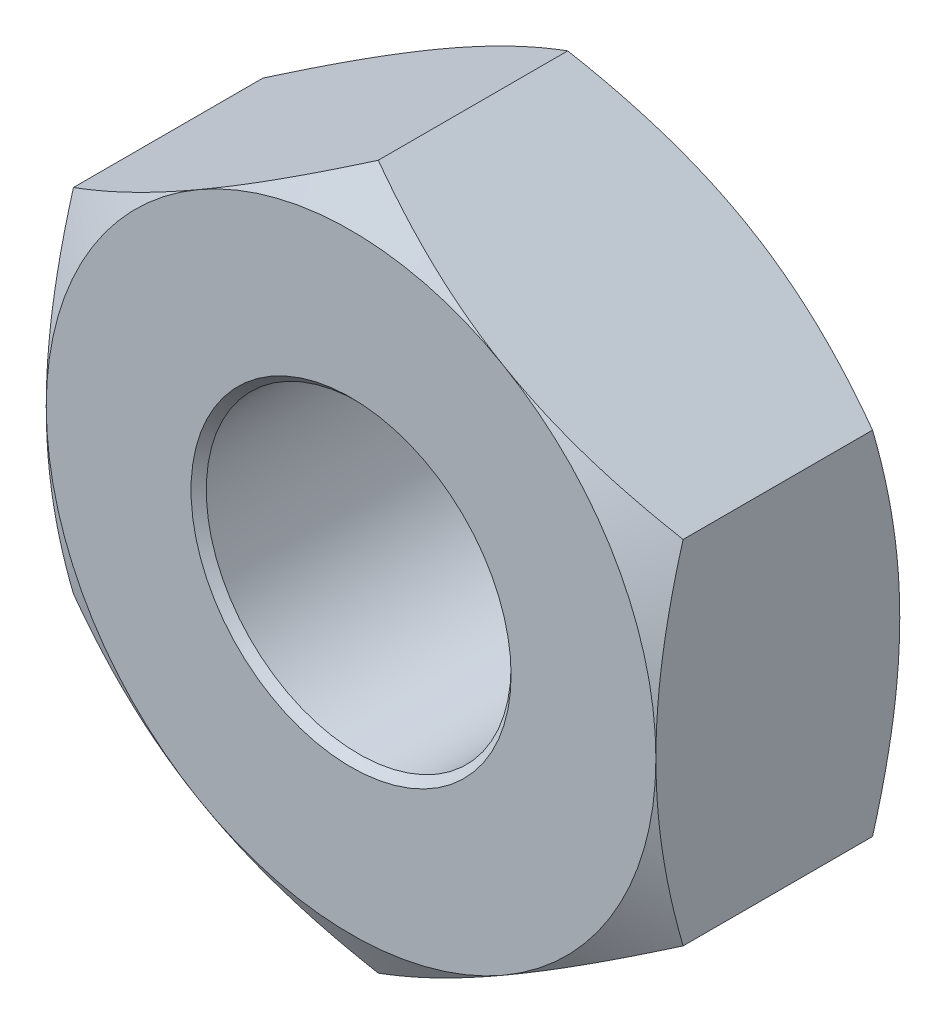
ISO-10303-21;
HEADER;
FILE_DESCRIPTION(('STEP AP214'),'2;1');
FILE_NAME('part.step','',(''),(''),'','','');
FILE_SCHEMA(('AUTOMOTIVE_DESIGN { 1 0 10303 214 1 1 1 1 }'));
ENDSEC;
DATA;
#1=APPLICATION_CONTEXT('core data for automotive mechanical design processes');
#2=APPLICATION_PROTOCOL_DEFINITION('international standard','automotive_design',2000,#1);
#3=PRODUCT_CONTEXT('',#1,'mechanical');
#4=PRODUCT('Part','Part','',(#3));
#5=PRODUCT_RELATED_PRODUCT_CATEGORY('part','',(#4));
#6=PRODUCT_DEFINITION_FORMATION('','',#4);
#7=PRODUCT_DEFINITION_CONTEXT('part definition',#1,'design');
#8=PRODUCT_DEFINITION('design','',#6,#7);
#9=PRODUCT_DEFINITION_SHAPE('','',#8);
#10=(LENGTH_UNIT() NAMED_UNIT(*) SI_UNIT(.MILLI.,.METRE.));
#11=(NAMED_UNIT(*) PLANE_ANGLE_UNIT() SI_UNIT($,.RADIAN.));
#12=(NAMED_UNIT(*) SI_UNIT($,.STERADIAN.) SOLID_ANGLE_UNIT());
#13=UNCERTAINTY_MEASURE_WITH_UNIT(LENGTH_MEASURE(1.E-05),#10,'distance_accuracy_value','');
#14=(GEOMETRIC_REPRESENTATION_CONTEXT(3) GLOBAL_UNCERTAINTY_ASSIGNED_CONTEXT((#13)) GLOBAL_UNIT_ASSIGNED_CONTEXT((#10,
#11,#12)) REPRESENTATION_CONTEXT('',''));
#15=CARTESIAN_POINT('',(0.,0.,0.));
#16=DIRECTION('',(0.,0.,1.));
#17=DIRECTION('',(1.,0.,0.));
#18=AXIS2_PLACEMENT_3D('',#15,#16,#17);
#19=CARTESIAN_POINT('',(0.,0.,1.6));
#20=DIRECTION('',(0.,0.,1.));
#21=DIRECTION('',(1.,0.,0.));
#22=AXIS2_PLACEMENT_3D('',#19,#20,#21);
#23=PLANE('',#22);
#24=CARTESIAN_POINT('',(0.,0.,1.6));
#25=DIRECTION('',(0.,0.,1.));
#26=DIRECTION('',(1.,0.,0.));
#27=AXIS2_PLACEMENT_3D('',#24,#25,#26);
#28=CIRCLE('',#27,1.04999948326116);
#29=CARTESIAN_POINT('',(1.04999948326116,0.,1.6));
#30=VERTEX_POINT('',#29);
#31=EDGE_CURVE('E55',#30,#30,#28,.F.);
#32=ORIENTED_EDGE('',*,*,#31,.T.);
#33=EDGE_LOOP('',(#32));
#34=FACE_BOUND('',#33,.T.);
#35=CARTESIAN_POINT('',(0.,0.,1.59999999999627));
#36=DIRECTION('',(0.,0.,-1.));
#37=DIRECTION('',(-1.,0.,0.));
#38=AXIS2_PLACEMENT_3D('',#35,#36,#37);
#39=CIRCLE('',#38,2.00000000000955);
#40=CARTESIAN_POINT('',(-2.00000000000477,-1.06547499753617E-11,1.59999999999903));
#41=VERTEX_POINT('',#40);
#42=CARTESIAN_POINT('',(-0.999999999983348,-1.73205080758389,1.59999999999908));
#43=VERTEX_POINT('',#42);
#44=EDGE_CURVE('E505',#41,#43,#39,.F.);
#45=ORIENTED_EDGE('',*,*,#44,.T.);
#46=CARTESIAN_POINT('',(0.,0.,1.59999999999627));
#47=DIRECTION('',(0.,0.,-1.));
#48=DIRECTION('',(-1.,0.,0.));
#49=AXIS2_PLACEMENT_3D('',#46,#47,#48);
#50=CIRCLE('',#49,2.00000000000955);
#51=CARTESIAN_POINT('',(1.00000000001005,-1.73205080756882,1.59999999999627));
#52=VERTEX_POINT('',#51);
#53=EDGE_CURVE('E509',#43,#52,#50,.F.);
#54=ORIENTED_EDGE('',*,*,#53,.T.);
#55=CARTESIAN_POINT('',(0.,0.,1.59999999999627));
#56=DIRECTION('',(0.,0.,-1.));
#57=DIRECTION('',(-1.,0.,0.));
#58=AXIS2_PLACEMENT_3D('',#55,#56,#57);
#59=CIRCLE('',#58,2.00000000000955);
#60=CARTESIAN_POINT('',(2.00000000000477,1.31078124881616E-11,1.59999999999903));
#61=VERTEX_POINT('',#60);
#62=EDGE_CURVE('E489',#52,#61,#59,.F.);
#63=ORIENTED_EDGE('',*,*,#62,.T.);
#64=CARTESIAN_POINT('',(0.,0.,1.59999999999627));
#65=DIRECTION('',(0.,0.,-1.));
#66=DIRECTION('',(-1.,0.,0.));
#67=AXIS2_PLACEMENT_3D('',#64,#65,#66);
#68=CIRCLE('',#67,2.00000000000955);
#69=CARTESIAN_POINT('',(0.999999999983347,1.73205080758389,1.59999999999908));
#70=VERTEX_POINT('',#69);
#71=EDGE_CURVE('E493',#61,#70,#68,.F.);
#72=ORIENTED_EDGE('',*,*,#71,.T.);
#73=CARTESIAN_POINT('',(0.,0.,1.59999999999627));
#74=DIRECTION('',(0.,0.,-1.));
#75=DIRECTION('',(-1.,0.,0.));
#76=AXIS2_PLACEMENT_3D('',#73,#74,#75);
#77=CIRCLE('',#76,2.00000000000955);
#78=CARTESIAN_POINT('',(-1.00000000001758,1.73205080756447,1.59999999999891));
#79=VERTEX_POINT('',#78);
#80=EDGE_CURVE('E497',#70,#79,#77,.F.);
#81=ORIENTED_EDGE('',*,*,#80,.T.);
#82=CARTESIAN_POINT('',(0.,0.,1.59999999999627));
#83=DIRECTION('',(0.,0.,-1.));
#84=DIRECTION('',(-1.,0.,0.));
#85=AXIS2_PLACEMENT_3D('',#82,#83,#84);
#86=CIRCLE('',#85,2.00000000000955);
#87=EDGE_CURVE('E501',#79,#41,#86,.F.);
#88=ORIENTED_EDGE('',*,*,#87,.T.);
#89=EDGE_LOOP('',(#45,#54,#63,#72,#81,#88));
#90=FACE_BOUND('',#89,.T.);
#91=ADVANCED_FACE('F44',(#34,#90),#23,.T.);
#92=CARTESIAN_POINT('',(0.,0.,0.179704591744212));
#93=DIRECTION('',(0.,0.,1.));
#94=DIRECTION('',(1.,0.,0.));
#95=AXIS2_PLACEMENT_3D('',#92,#93,#94);
#96=CONICAL_SURFACE('',#95,2.31125748325667,1.04719755118647);
#97=CARTESIAN_POINT('',(1.00000000009983,-1.73205080751171,-5.27795129464394E-12));
#98=CARTESIAN_POINT('',(0.957553135780858,-1.75655751605253,-6.25001354358371E-06));
#99=CARTESIAN_POINT('',(0.915112033127915,-1.78106089809391,0.00104087786203287));
#100=CARTESIAN_POINT('',(0.830313163211141,-1.83001954846734,0.00518690912419284));
#101=CARTESIAN_POINT('',(0.787955381114201,-1.85447482536328,0.00828540632418732));
#102=CARTESIAN_POINT('',(0.661526349253162,-1.92746866094164,0.0205338276065958));
#103=CARTESIAN_POINT('',(0.577659688525369,-1.97588910008887,0.0326378545118785));
#104=CARTESIAN_POINT('',(0.411032187688577,-2.07209153255139,0.0637636982833002));
#105=CARTESIAN_POINT('',(0.328270220585604,-2.11987417653696,0.0827777998463105));
#106=CARTESIAN_POINT('',(0.163458169984431,-2.21502845831724,0.126628872500844));
#107=CARTESIAN_POINT('',(0.0814138361323034,-2.26239677655225,0.151494923979016));
#108=CARTESIAN_POINT('',(8.39387136399563E-08,-2.30940102829696,0.178632766973462));
#109=B_SPLINE_CURVE_WITH_KNOTS('',3,(#97,#98,#99,#100,#101,#102,#103,#104,#105,#106,#107,#108),
.UNSPECIFIED.,.F.,.F.,(4,2,2,2,2,4),(0.,0.147016662691409,0.294004223678316,0.586460846601992,
0.878591931243796,1.17220656932657),.UNSPECIFIED.);
#110=CARTESIAN_POINT('',(1.00000000005232,-1.73205080754442,0.));
#111=VERTEX_POINT('',#110);
#112=CARTESIAN_POINT('',(2.88638918786199E-08,-2.30940109342323,0.178632804574129));
#113=VERTEX_POINT('',#112);
#114=EDGE_CURVE('E132',#111,#113,#109,.T.);
#115=ORIENTED_EDGE('',*,*,#114,.T.);
#116=CARTESIAN_POINT('',(5.7727783417525E-08,-2.30940111008745,0.178632814195226));
#117=CARTESIAN_POINT('',(-0.0814137056232576,-2.26239685190099,0.15149496461561));
#118=CARTESIAN_POINT('',(-0.16345805080081,-2.21502852712724,0.126628906855918));
#119=CARTESIAN_POINT('',(-0.32827012427305,-2.11987423214234,0.0827778228415323));
#120=CARTESIAN_POINT('',(-0.411032102918675,-2.07209158149262,0.0637637161885128));
#121=CARTESIAN_POINT('',(-0.57765962727959,-1.97588913544844,0.0326378638856466));
#122=CARTESIAN_POINT('',(-0.661526299989791,-1.92746868938316,0.0205338335442737));
#123=CARTESIAN_POINT('',(-0.787955350075264,-1.85447484328292,0.00828540874369762));
#124=CARTESIAN_POINT('',(-0.830313138326771,-1.83001956283364,0.00518691064340968));
#125=CARTESIAN_POINT('',(-0.915112020591133,-1.78106090533133,0.00104087817053289));
#126=CARTESIAN_POINT('',(-0.957553129437112,-1.75655751971439,-6.25001511778424E-06));
#127=CARTESIAN_POINT('',(-0.9999999999518,-1.73205080759648,-5.62636136566686E-12));
#128=B_SPLINE_CURVE_WITH_KNOTS('',3,(#116,#117,#118,#119,#120,#121,#122,#123,#124,#125,#126,
#127),.UNSPECIFIED.,.F.,.F.,(4,2,2,2,2,4),(0.,0.293614680744132,0.585745807531427,
0.878202472794855,1.02519005521309,1.17220673935671),.UNSPECIFIED.);
#129=CARTESIAN_POINT('',(-0.999999999954236,-1.7320508076007,-2.81314002525196E-12));
#130=VERTEX_POINT('',#129);
#131=EDGE_CURVE('E142',#113,#130,#128,.T.);
#132=ORIENTED_EDGE('',*,*,#131,.T.);
#133=CARTESIAN_POINT('',(0.,0.,0.));
#134=DIRECTION('',(0.,0.,1.));
#135=DIRECTION('',(1.,0.,0.));
#136=AXIS2_PLACEMENT_3D('',#133,#134,#135);
#137=CIRCLE('',#136,2.00000000000955);
#138=EDGE_CURVE('E146',#130,#111,#137,.T.);
#139=ORIENTED_EDGE('',*,*,#138,.T.);
#140=EDGE_LOOP('',(#115,#132,#139));
#141=FACE_BOUND('',#140,.T.);
#142=ADVANCED_FACE('F148',(#141),#96,.T.);
#143=CARTESIAN_POINT('',(0.,0.,0.179704591744212));
#144=DIRECTION('',(0.,0.,1.));
#145=DIRECTION('',(1.,0.,0.));
#146=AXIS2_PLACEMENT_3D('',#143,#144,#145);
#147=CONICAL_SURFACE('',#146,2.31125748325667,1.04719755118647);
#148=CARTESIAN_POINT('',(0.9999999999518,1.73205080759648,-5.6263452677451E-12));
#149=CARTESIAN_POINT('',(1.04244686426861,1.70754409905691,-6.25001304988145E-06));
#150=CARTESIAN_POINT('',(1.08488796691937,1.68304071701679,0.00104087786325986));
#151=CARTESIAN_POINT('',(1.16968683683177,1.63408206664589,0.00518690912666146));
#152=CARTESIAN_POINT('',(1.21204461892652,1.60962678975121,0.00828540632716436));
#153=CARTESIAN_POINT('',(1.33847365078104,1.53663295417662,0.0205338276107514));
#154=CARTESIAN_POINT('',(1.4223403115045,1.48821251503189,0.0326378545163663));
#155=CARTESIAN_POINT('',(1.58896781233272,1.39201008257432,0.0637636982876378));
#156=CARTESIAN_POINT('',(1.67172977943145,1.3442274385912,0.0827777998501674));
#157=CARTESIAN_POINT('',(1.83654183002418,1.24907315681579,0.126628872503088));
#158=CARTESIAN_POINT('',(1.91858616387211,1.2017048385832,0.15149492398012));
#159=CARTESIAN_POINT('',(1.99999991606156,1.15470058684088,0.178632766973196));
#160=B_SPLINE_CURVE_WITH_KNOTS('',3,(#148,#149,#150,#151,#152,#153,#154,#155,#156,#157,#158,
#159),.UNSPECIFIED.,.F.,.F.,(4,2,2,2,2,4),(0.,0.147016662683917,0.294004223663335,
0.586460846572301,0.878591931199455,1.17220656926731),.UNSPECIFIED.);
#161=CARTESIAN_POINT('',(0.999999999978304,1.7320508075868,0.));
#162=VERTEX_POINT('',#161);
#163=CARTESIAN_POINT('',(2.,1.15470057170804,0.178632804573939));
#164=VERTEX_POINT('',#163);
#165=EDGE_CURVE('E378',#162,#164,#160,.T.);
#166=ORIENTED_EDGE('',*,*,#165,.T.);
#167=CARTESIAN_POINT('',(2.,1.15470060503708,0.178632814195205));
#168=CARTESIAN_POINT('',(2.,1.06069208866294,0.151494964615247));
#169=CARTESIAN_POINT('',(2.,0.965955439114202,0.126628906855271));
#170=CARTESIAN_POINT('',(2.,0.775646849141912,0.0827778228404902));
#171=CARTESIAN_POINT('',(2.,0.680081547841225,0.0637637161873568));
#172=CARTESIAN_POINT('',(2.,0.487676655750345,0.0326378638844715));
#173=CARTESIAN_POINT('',(2.,0.390835763618521,0.0205338335431938));
#174=CARTESIAN_POINT('',(2.,0.244848071416126,0.00828540874293441));
#175=CARTESIAN_POINT('',(2.,0.195937510516907,0.00518691064278159));
#176=CARTESIAN_POINT('',(2.,0.0980201955109998,0.00104087817023259));
#177=CARTESIAN_POINT('',(2.,0.0490134242764938,-6.25001522539535E-06));
#178=CARTESIAN_POINT('',(2.,4.00311871255267E-11,-5.51340468006996E-12));
#179=B_SPLINE_CURVE_WITH_KNOTS('',3,(#167,#168,#169,#170,#171,#172,#173,#174,#175,#176,#177,
#178),.UNSPECIFIED.,.F.,.F.,(4,2,2,2,2,4),(0.,0.293614680747936,0.585745807538968,
0.878202472806148,1.0251900552263,1.17220673937183),.UNSPECIFIED.);
#180=CARTESIAN_POINT('',(2.00000000000477,2.66878533161652E-11,0.));
#181=VERTEX_POINT('',#180);
#182=EDGE_CURVE('E351',#164,#181,#179,.T.);
#183=ORIENTED_EDGE('',*,*,#182,.T.);
#184=CARTESIAN_POINT('',(0.,0.,0.));
#185=DIRECTION('',(0.,0.,1.));
#186=DIRECTION('',(1.,0.,0.));
#187=AXIS2_PLACEMENT_3D('',#184,#185,#186);
#188=CIRCLE('',#187,2.00000000000955);
#189=EDGE_CURVE('E154',#181,#162,#188,.T.);
#190=ORIENTED_EDGE('',*,*,#189,.T.);
#191=EDGE_LOOP('',(#166,#183,#190));
#192=FACE_BOUND('',#191,.T.);
#193=ADVANCED_FACE('F369',(#192),#147,.T.);
#194=CARTESIAN_POINT('',(0.,0.,0.179704591744212));
#195=DIRECTION('',(0.,0.,1.));
#196=DIRECTION('',(1.,0.,0.));
#197=AXIS2_PLACEMENT_3D('',#194,#195,#196);
#198=CONICAL_SURFACE('',#197,2.31125748325667,1.04719755118647);
#199=CARTESIAN_POINT('',(-1.00000000009983,1.73205080751171,-5.27806108294615E-12));
#200=CARTESIAN_POINT('',(-0.957553135780819,1.75655751605255,-6.25001354380122E-06));
#201=CARTESIAN_POINT('',(-0.915112033127838,1.78106089809395,0.00104087786203455));
#202=CARTESIAN_POINT('',(-0.830313163210987,1.83001954846743,0.00518690912420207));
#203=CARTESIAN_POINT('',(-0.787955381114008,1.85447482536339,0.0082854063242022));
#204=CARTESIAN_POINT('',(-0.661526349252856,1.92746866094182,0.0205338276066326));
#205=CARTESIAN_POINT('',(-0.577659688524988,1.97588910008909,0.0326378545119368));
#206=CARTESIAN_POINT('',(-0.411032187688049,2.07209153255169,0.0637636982834116));
#207=CARTESIAN_POINT('',(-0.328270220585004,2.1198741765373,0.0827777998464536));
#208=CARTESIAN_POINT('',(-0.163458169983688,2.21502845831767,0.126628872501058));
#209=CARTESIAN_POINT('',(-0.0814138361314898,2.26239677655272,0.151494923979269));
#210=CARTESIAN_POINT('',(-8.39378305998906E-08,2.30940102829747,0.178632766973757));
#211=B_SPLINE_CURVE_WITH_KNOTS('',3,(#199,#200,#201,#202,#203,#204,#205,#206,#207,#208,#209,
#210),.UNSPECIFIED.,.F.,.F.,(4,2,2,2,2,4),(0.,0.147016662691544,0.294004223678584,
0.586460846602524,0.878591931244592,1.17220656932763),.UNSPECIFIED.);
#212=CARTESIAN_POINT('',(-1.00000000005232,1.73205080754442,0.));
#213=VERTEX_POINT('',#212);
#214=CARTESIAN_POINT('',(-2.88634248931267E-08,2.30940109342296,0.178632804573974));
#215=VERTEX_POINT('',#214);
#216=EDGE_CURVE('E340',#213,#215,#211,.T.);
#217=ORIENTED_EDGE('',*,*,#216,.T.);
#218=CARTESIAN_POINT('',(-5.77268495065159E-08,2.30940111008692,0.178632814194914));
#219=CARTESIAN_POINT('',(0.0814137056241179,2.26239685190049,0.151494964615342));
#220=CARTESIAN_POINT('',(0.163458050801595,2.21502852712679,0.126628906855692));
#221=CARTESIAN_POINT('',(0.328270124273685,2.11987423214197,0.082777822841381));
#222=CARTESIAN_POINT('',(0.411032102919234,2.0720915814923,0.0637637161883951));
#223=CARTESIAN_POINT('',(0.577659627279993,1.97588913544821,0.032637863885585));
#224=CARTESIAN_POINT('',(0.661526299990115,1.92746868938298,0.0205338335442345));
#225=CARTESIAN_POINT('',(0.787955350075468,1.85447484328281,0.00828540874368162));
#226=CARTESIAN_POINT('',(0.830313138326935,1.83001956283354,0.00518691064339969));
#227=CARTESIAN_POINT('',(0.915112020591215,1.78106090533128,0.00104087817053097));
#228=CARTESIAN_POINT('',(0.957553129437153,1.75655751971437,-6.25001511765103E-06));
#229=CARTESIAN_POINT('',(0.9999999999518,1.73205080759648,-5.62635806153146E-12));
#230=B_SPLINE_CURVE_WITH_KNOTS('',3,(#218,#219,#220,#221,#222,#223,#224,#225,#226,#227,#228,
#229),.UNSPECIFIED.,.F.,.F.,(4,2,2,2,2,4),(0.,0.29361468074385,0.585745807530867,
0.878202472794016,1.02519005521211,1.17220673935559),.UNSPECIFIED.);
#231=EDGE_CURVE('E350',#215,#162,#230,.T.);
#232=ORIENTED_EDGE('',*,*,#231,.T.);
#233=CARTESIAN_POINT('',(0.,0.,0.));
#234=DIRECTION('',(0.,0.,1.));
#235=DIRECTION('',(1.,0.,0.));
#236=AXIS2_PLACEMENT_3D('',#233,#234,#235);
#237=CIRCLE('',#236,2.00000000000955);
#238=EDGE_CURVE('E408',#162,#213,#237,.T.);
#239=ORIENTED_EDGE('',*,*,#238,.T.);
#240=EDGE_LOOP('',(#217,#232,#239));
#241=FACE_BOUND('',#240,.T.);
#242=ADVANCED_FACE('F366',(#241),#198,.T.);
#243=CARTESIAN_POINT('',(0.,0.,0.179704591744212));
#244=DIRECTION('',(0.,0.,1.));
#245=DIRECTION('',(1.,0.,0.));
#246=AXIS2_PLACEMENT_3D('',#243,#244,#245);
#247=CONICAL_SURFACE('',#246,2.31125748325667,1.04719755118647);
#248=CARTESIAN_POINT('',(-2.,-5.33767046691394E-11,-5.51342620309762E-12));
#249=CARTESIAN_POINT('',(-2.,0.049013417026454,-6.25001290602224E-06));
#250=CARTESIAN_POINT('',(-2.,0.0980201811073974,0.0010408778634648));
#251=CARTESIAN_POINT('',(-2.,0.195937481850585,0.00518690912704514));
#252=CARTESIAN_POINT('',(-2.,0.244848035640629,0.00828540632766568));
#253=CARTESIAN_POINT('',(-2.,0.390835706791857,0.0205338276116828));
#254=CARTESIAN_POINT('',(-2.,0.487676585082651,0.0326378545176879));
#255=CARTESIAN_POINT('',(-2.,0.680081450000423,0.0637636982898924));
#256=CARTESIAN_POINT('',(-2.,0.775646737967949,0.0827777998529646));
#257=CARTESIAN_POINT('',(-2.,0.96595530152132,0.126628872507076));
#258=CARTESIAN_POINT('',(-2.,1.06069193798775,0.151494923984757));
#259=CARTESIAN_POINT('',(-2.,1.15470044147364,0.178632766978506));
#260=B_SPLINE_CURVE_WITH_KNOTS('',3,(#248,#249,#250,#251,#252,#253,#254,#255,#256,#257,#258,
#259),.UNSPECIFIED.,.F.,.F.,(4,2,2,2,2,4),(0.,0.147016662686009,0.294004223667515,
0.586460846580613,0.878591931211879,1.17220656928389),.UNSPECIFIED.);
#261=CARTESIAN_POINT('',(-2.00000000000477,-2.66883067798067E-11,0.));
#262=VERTEX_POINT('',#261);
#263=CARTESIAN_POINT('',(-2.00000002886338,1.15470052171507,0.178632804573899));
#264=VERTEX_POINT('',#263);
#265=EDGE_CURVE('E611',#262,#264,#260,.T.);
#266=ORIENTED_EDGE('',*,*,#265,.T.);
#267=CARTESIAN_POINT('',(-2.00000005772675,1.15470050505114,0.178632814195125));
#268=CARTESIAN_POINT('',(-1.91858629437994,1.20170476323516,0.151494964616954));
#269=CARTESIAN_POINT('',(-1.8365419492067,1.24907308800642,0.126628906858471));
#270=CARTESIAN_POINT('',(-1.67172987574311,1.34422738298633,0.0827778228458259));
#271=CARTESIAN_POINT('',(-1.58896789710183,1.39201003363354,0.0637637161933441));
#272=CARTESIAN_POINT('',(-1.42234037274971,1.48821247967265,0.0326378638907243));
#273=CARTESIAN_POINT('',(-1.33847370004395,1.53663292573536,0.020533833549058));
#274=CARTESIAN_POINT('',(-1.21204464996517,1.60962677183173,0.00828540874734357));
#275=CARTESIAN_POINT('',(-1.16968686171591,1.63408205227972,0.00518691064655762));
#276=CARTESIAN_POINT('',(-1.08488797945604,1.68304070977944,0.00104087817245321));
#277=CARTESIAN_POINT('',(-1.0424468706123,1.70754409539508,-6.25001392717059E-06));
#278=CARTESIAN_POINT('',(-1.00000000009983,1.73205080751171,-5.27799223848253E-12));
#279=B_SPLINE_CURVE_WITH_KNOTS('',3,(#267,#268,#269,#270,#271,#272,#273,#274,#275,#276,#277,
#278),.UNSPECIFIED.,.F.,.F.,(4,2,2,2,2,4),(0.,0.29361468072882,0.585745807501071,
0.878202472749394,1.02519005515994,1.17220673929587),.UNSPECIFIED.);
#280=EDGE_CURVE('E242',#264,#213,#279,.T.);
#281=ORIENTED_EDGE('',*,*,#280,.T.);
#282=CARTESIAN_POINT('',(0.,0.,0.));
#283=DIRECTION('',(0.,0.,1.));
#284=DIRECTION('',(1.,0.,0.));
#285=AXIS2_PLACEMENT_3D('',#282,#283,#284);
#286=CIRCLE('',#285,2.00000000000955);
#287=EDGE_CURVE('E402',#213,#262,#286,.T.);
#288=ORIENTED_EDGE('',*,*,#287,.T.);
#289=EDGE_LOOP('',(#266,#281,#288));
#290=FACE_BOUND('',#289,.T.);
#291=ADVANCED_FACE('F220',(#290),#247,.T.);
#292=CARTESIAN_POINT('',(0.,0.,0.179704591744212));
#293=DIRECTION('',(0.,0.,1.));
#294=DIRECTION('',(1.,0.,0.));
#295=AXIS2_PLACEMENT_3D('',#292,#293,#294);
#296=CONICAL_SURFACE('',#295,2.31125748325667,1.04719755118647);
#297=CARTESIAN_POINT('',(-0.9999999999518,-1.73205080759648,-5.62633943232003E-12));
#298=CARTESIAN_POINT('',(-1.04244686426863,-1.7075440990569,-6.25001304991466E-06));
#299=CARTESIAN_POINT('',(-1.08488796691942,-1.68304071701676,0.00104087786326082));
#300=CARTESIAN_POINT('',(-1.16968683683186,-1.63408206664584,0.00518690912666636));
#301=CARTESIAN_POINT('',(-1.21204461892662,-1.60962678975115,0.0082854063271722));
#302=CARTESIAN_POINT('',(-1.3384736507812,-1.53663295417652,0.0205338276107708));
#303=CARTESIAN_POINT('',(-1.4223403115047,-1.48821251503177,0.032637854516397));
#304=CARTESIAN_POINT('',(-1.588967812333,-1.39201008257416,0.0637636982876966));
#305=CARTESIAN_POINT('',(-1.67172977943177,-1.34422743859101,0.0827777998502432));
#306=CARTESIAN_POINT('',(-1.83654183002457,-1.24907315681556,0.126628872503201));
#307=CARTESIAN_POINT('',(-1.91858616387254,-1.20170483858295,0.151494923980254));
#308=CARTESIAN_POINT('',(-1.99999991606203,-1.15470058684061,0.178632766973351));
#309=B_SPLINE_CURVE_WITH_KNOTS('',3,(#297,#298,#299,#300,#301,#302,#303,#304,#305,#306,#307,
#308),.UNSPECIFIED.,.F.,.F.,(4,2,2,2,2,4),(0.,0.147016662683988,0.294004223663476,
0.586460846572582,0.878591931199875,1.17220656926787),.UNSPECIFIED.);
#310=CARTESIAN_POINT('',(-2.,-1.15470057170776,0.178632804573857));
#311=VERTEX_POINT('',#310);
#312=EDGE_CURVE('E233',#130,#311,#309,.T.);
#313=ORIENTED_EDGE('',*,*,#312,.T.);
#314=CARTESIAN_POINT('',(-2.,-1.15470060503651,0.178632814195041));
#315=CARTESIAN_POINT('',(-2.,-1.06069208866348,0.151494964615416));
#316=CARTESIAN_POINT('',(-2.,-0.965955439115889,0.12662890685572));
#317=CARTESIAN_POINT('',(-2.,-0.775646849145885,0.0827778228413454));
#318=CARTESIAN_POINT('',(-2.,-0.680081547846346,0.0637637161883398));
#319=CARTESIAN_POINT('',(-2.,-0.487676655757788,0.0326378638855213));
#320=CARTESIAN_POINT('',(-2.,-0.390835763627138,0.0205338335441823));
#321=CARTESIAN_POINT('',(-2.,-0.24484807142651,0.00828540874367189));
#322=CARTESIAN_POINT('',(-2.,-0.195937510527888,0.00518691064340841));
#323=CARTESIAN_POINT('',(-2.,-0.0980201955231668,0.00104087817058528));
#324=CARTESIAN_POINT('',(-2.,-0.049013424289252,-6.25001503620835E-06));
#325=CARTESIAN_POINT('',(-2.,-5.33767316786114E-11,-5.51341068668862E-12));
#326=B_SPLINE_CURVE_WITH_KNOTS('',3,(#314,#315,#316,#317,#318,#319,#320,#321,#322,#323,#324,
#325),.UNSPECIFIED.,.F.,.F.,(4,2,2,2,2,4),(0.,0.29361468074443,0.585745807532018,
0.878202472795739,1.02519005521413,1.1722067393579),.UNSPECIFIED.);
#327=EDGE_CURVE('E155',#311,#262,#326,.T.);
#328=ORIENTED_EDGE('',*,*,#327,.T.);
#329=CARTESIAN_POINT('',(0.,0.,0.));
#330=DIRECTION('',(0.,0.,1.));
#331=DIRECTION('',(1.,0.,0.));
#332=AXIS2_PLACEMENT_3D('',#329,#330,#331);
#333=CIRCLE('',#332,2.00000000000955);
#334=EDGE_CURVE('E168',#262,#130,#333,.T.);
#335=ORIENTED_EDGE('',*,*,#334,.T.);
#336=EDGE_LOOP('',(#313,#328,#335));
#337=FACE_BOUND('',#336,.T.);
#338=ADVANCED_FACE('F215',(#337),#296,.T.);
#339=CARTESIAN_POINT('',(0.,0.,0.));
#340=DIRECTION('',(0.,0.,1.));
#341=DIRECTION('',(1.,0.,0.));
#342=AXIS2_PLACEMENT_3D('',#339,#340,#341);
#343=PLANE('',#342);
#344=CARTESIAN_POINT('',(0.,0.,0.));
#345=DIRECTION('',(0.,0.,1.));
#346=DIRECTION('',(1.,0.,0.));
#347=AXIS2_PLACEMENT_3D('',#344,#345,#346);
#348=CIRCLE('',#347,1.04999939043775);
#349=CARTESIAN_POINT('',(1.04999939043775,0.,0.));
#350=VERTEX_POINT('',#349);
#351=EDGE_CURVE('E12',#350,#350,#348,.T.);
#352=ORIENTED_EDGE('',*,*,#351,.T.);
#353=EDGE_LOOP('',(#352));
#354=FACE_BOUND('',#353,.T.);
#355=ORIENTED_EDGE('',*,*,#287,.F.);
#356=ORIENTED_EDGE('',*,*,#238,.F.);
#357=ORIENTED_EDGE('',*,*,#189,.F.);
#358=CARTESIAN_POINT('',(0.,0.,0.));
#359=DIRECTION('',(0.,0.,1.));
#360=DIRECTION('',(1.,0.,0.));
#361=AXIS2_PLACEMENT_3D('',#358,#359,#360);
#362=CIRCLE('',#361,2.00000000000955);
#363=EDGE_CURVE('E159',#111,#181,#362,.T.);
#364=ORIENTED_EDGE('',*,*,#363,.F.);
#365=ORIENTED_EDGE('',*,*,#138,.F.);
#366=ORIENTED_EDGE('',*,*,#334,.F.);
#367=EDGE_LOOP('',(#355,#356,#357,#364,#365,#366));
#368=FACE_BOUND('',#367,.T.);
#369=ADVANCED_FACE('F161',(#354,#368),#343,.F.);
#370=CARTESIAN_POINT('',(0.,0.,0.179704591744212));
#371=DIRECTION('',(0.,0.,1.));
#372=DIRECTION('',(1.,0.,0.));
#373=AXIS2_PLACEMENT_3D('',#370,#371,#372);
#374=CONICAL_SURFACE('',#373,2.31125748325667,1.04719755118647);
#375=CARTESIAN_POINT('',(2.,-1.15470053837967,0.178632794952867));
#376=CARTESIAN_POINT('',(2.,-1.06069202725453,0.151494948056026));
#377=CARTESIAN_POINT('',(2.,-0.965955383033819,0.126628892855476));
#378=CARTESIAN_POINT('',(2.,-0.775646803821193,0.0827778134693832));
#379=CARTESIAN_POINT('',(2.,-0.680081507950736,0.0637637088902694));
#380=CARTESIAN_POINT('',(2.,-0.487676626926771,0.032637860063797));
#381=CARTESIAN_POINT('',(2.,-0.390835740432073,0.020533831122735));
#382=CARTESIAN_POINT('',(2.,-0.24484805680338,0.00828540775628686));
#383=CARTESIAN_POINT('',(2.,-0.195937498799585,0.00518691002308071));
#384=CARTESIAN_POINT('',(2.,-0.0980201896026204,0.00104087804410156));
#385=CARTESIAN_POINT('',(2.,-0.0490134212816412,-6.25001487552063E-06));
#386=CARTESIAN_POINT('',(2.,4.00313936686878E-11,-5.5134269261355E-12));
#387=B_SPLINE_CURVE_WITH_KNOTS('',3,(#375,#376,#377,#378,#379,#380,#381,#382,#383,#384,#385,
#386),.UNSPECIFIED.,.F.,.F.,(4,2,2,2,2,4),(0.,0.293614663366676,0.585745772986611,
0.878202421003547,1.02518999469206,1.17220667009745),.UNSPECIFIED.);
#388=CARTESIAN_POINT('',(2.00000000000015,-1.1547005383796,0.178632794952921));
#389=VERTEX_POINT('',#388);
#390=EDGE_CURVE('E167',#389,#181,#387,.T.);
#391=ORIENTED_EDGE('',*,*,#390,.F.);
#392=CARTESIAN_POINT('',(1.00000000009983,-1.73205080751171,-5.27795129464394E-12));
#393=CARTESIAN_POINT('',(1.04244686808513,-1.70754409685414,-6.25001244244305E-06));
#394=CARTESIAN_POINT('',(1.08488797440278,-1.68304071269694,0.00104087804844608));
#395=CARTESIAN_POINT('',(1.16968685162612,-1.63408205810506,0.00518691003065754));
#396=CARTESIAN_POINT('',(1.21204463736493,-1.60962677910648,0.00828540776518474));
#397=CARTESIAN_POINT('',(1.33847368000998,-1.53663293730198,0.0205338311346876));
#398=CARTESIAN_POINT('',(1.42234034782806,-1.48821249406117,0.0326378600765974));
#399=CARTESIAN_POINT('',(1.58896786258452,-1.39201005356212,0.0637637089026315));
#400=CARTESIAN_POINT('',(1.67172983651743,-1.34422740563329,0.0827778134804641));
#401=CARTESIAN_POINT('',(1.83654190065161,-1.24907311603972,0.126628892862288));
#402=CARTESIAN_POINT('',(1.91858624120504,-1.20170479393571,0.151494948059832));
#403=CARTESIAN_POINT('',(2.00000000000056,-1.15470053837937,0.178632794953062));
#404=B_SPLINE_CURVE_WITH_KNOTS('',3,(#392,#393,#394,#395,#396,#397,#398,#399,#400,#401,#402,
#403),.UNSPECIFIED.,.F.,.F.,(4,2,2,2,2,4),(0.,0.14701667538579,0.29400424905471,
0.586460897033172,0.878592006614788,1.17220666994246),.UNSPECIFIED.);
#405=EDGE_CURVE('E136',#111,#389,#404,.T.);
#406=ORIENTED_EDGE('',*,*,#405,.F.);
#407=ORIENTED_EDGE('',*,*,#363,.T.);
#408=EDGE_LOOP('',(#391,#406,#407));
#409=FACE_BOUND('',#408,.T.);
#410=ADVANCED_FACE('F170',(#409),#374,.T.);
#411=CARTESIAN_POINT('',(2.,-1.154700538379,0.));
#412=DIRECTION('',(1.,0.,0.));
#413=DIRECTION('',(0.,0.,-1.));
#414=AXIS2_PLACEMENT_3D('',#411,#412,#413);
#415=PLANE('',#414);
#416=ORIENTED_EDGE('',*,*,#390,.T.);
#417=ORIENTED_EDGE('',*,*,#182,.F.);
#418=DIRECTION('',(0.,0.,1.));
#419=VECTOR('',#418,1.);
#420=CARTESIAN_POINT('',(2.,1.154700538379,0.));
#421=LINE('',#420,#419);
#422=CARTESIAN_POINT('',(2.00000002886352,1.15470052171464,1.42136719542242));
#423=VERTEX_POINT('',#422);
#424=EDGE_CURVE('E513',#423,#164,#421,.F.);
#425=ORIENTED_EDGE('',*,*,#424,.F.);
#426=CARTESIAN_POINT('',(2.,1.31076429289663E-11,1.60000000000178));
#427=CARTESIAN_POINT('',(2.,0.049013416979038,1.60000625000818));
#428=CARTESIAN_POINT('',(2.,0.0980201809461086,1.59895912213577));
#429=CARTESIAN_POINT('',(2.,0.195937481462217,1.59481309088953));
#430=CARTESIAN_POINT('',(2.,0.244848035139054,1.59171459370228));
#431=CARTESIAN_POINT('',(2.,0.390835705955042,1.57946617247148));
#432=CARTESIAN_POINT('',(2.,0.487676584025357,1.5673621456184));
#433=CARTESIAN_POINT('',(2.,0.680081448510192,1.53623630197874));
#434=CARTESIAN_POINT('',(2.,0.775646736265243,1.5172222004952));
#435=CARTESIAN_POINT('',(2.,0.965955299397549,1.47337112801922));
#436=CARTESIAN_POINT('',(2.,1.06069193565544,1.44850507664033));
#437=CARTESIAN_POINT('',(2.,1.1547004389359,1.42136723375035));
#438=B_SPLINE_CURVE_WITH_KNOTS('',3,(#426,#427,#428,#429,#430,#431,#432,#433,#434,#435,#436,
#437),.UNSPECIFIED.,.F.,.F.,(4,2,2,2,2,4),(0.,0.147016662344472,0.294004222984769,
0.586460845223875,0.878591929184232,1.17220656657703),.UNSPECIFIED.);
#439=EDGE_CURVE('E440',#61,#423,#438,.T.);
#440=ORIENTED_EDGE('',*,*,#439,.F.);
#441=CARTESIAN_POINT('',(1.99999996249516,-1.15470059848941,1.42136716313678));
#442=CARTESIAN_POINT('',(1.99999998658185,-1.0606920856918,1.44850502744351));
#443=CARTESIAN_POINT('',(1.99999999641751,-0.965955437455712,1.47337109123933));
#444=CARTESIAN_POINT('',(2.00000000356439,-0.775646848337716,1.51722217961337));
#445=CARTESIAN_POINT('',(2.00000000093865,-0.680081546591718,1.5362362846417));
#446=CARTESIAN_POINT('',(1.99999999906031,-0.487676654533733,1.56736213567737));
#447=CARTESIAN_POINT('',(1.99999999981147,-0.390835762885419,1.57946616640644));
#448=CARTESIAN_POINT('',(2.00000000009475,-0.244848071167704,1.59171459132852));
#449=CARTESIAN_POINT('',(2.00000000004738,-0.195937510333975,1.59481308939204));
#450=CARTESIAN_POINT('',(1.99999999995261,-0.0980201954075246,1.5989591217996));
#451=CARTESIAN_POINT('',(1.99999999990521,-0.0490134241868954,1.60000624995453));
#452=CARTESIAN_POINT('',(2.,1.31075346405546E-11,1.60000000000178));
#453=B_SPLINE_CURVE_WITH_KNOTS('',3,(#441,#442,#443,#444,#445,#446,#447,#448,#449,#450,#451,
#452),.UNSPECIFIED.,.F.,.F.,(4,2,2,2,2,4),(0.,0.293614681497449,0.58574580835799,
0.878202472518098,1.02519005471836,1.17220673879966),.UNSPECIFIED.);
#454=CARTESIAN_POINT('',(2.00000000000015,-1.15470057170597,1.42136719542286));
#455=VERTEX_POINT('',#454);
#456=EDGE_CURVE('E179',#455,#61,#453,.T.);
#457=ORIENTED_EDGE('',*,*,#456,.F.);
#458=DIRECTION('',(0.,0.,1.));
#459=VECTOR('',#458,1.);
#460=CARTESIAN_POINT('',(2.0000000000003,-1.15470053837952,0.));
#461=LINE('',#460,#459);
#462=EDGE_CURVE('E180',#389,#455,#461,.T.);
#463=ORIENTED_EDGE('',*,*,#462,.F.);
#464=EDGE_LOOP('',(#416,#417,#425,#440,#457,#463));
#465=FACE_BOUND('',#464,.T.);
#466=ADVANCED_FACE('F209',(#465),#415,.T.);
#467=CARTESIAN_POINT('',(2.,1.154700538379,0.));
#468=DIRECTION('',(0.500000000000017,0.866025403784429,0.));
#469=DIRECTION('',(-0.866025403784429,0.500000000000017,0.));
#470=AXIS2_PLACEMENT_3D('',#467,#468,#469);
#471=PLANE('',#470);
#472=ORIENTED_EDGE('',*,*,#165,.F.);
#473=ORIENTED_EDGE('',*,*,#231,.F.);
#474=DIRECTION('',(0.,0.,1.));
#475=VECTOR('',#474,1.);
#476=CARTESIAN_POINT('',(0.,2.309401076759,0.));
#477=LINE('',#476,#475);
#478=CARTESIAN_POINT('',(2.88597370231612E-08,2.30940109342118,1.42136719542333));
#479=VERTEX_POINT('',#478);
#480=EDGE_CURVE('E517',#479,#215,#477,.F.);
#481=ORIENTED_EDGE('',*,*,#480,.F.);
#482=CARTESIAN_POINT('',(0.999999999980911,1.73205080757967,1.6000000000019));
#483=CARTESIAN_POINT('',(0.957553135762124,1.75655751606265,1.60000625000817));
#484=CARTESIAN_POINT('',(0.915112033209364,1.78106089804619,1.59895912213563));
#485=CARTESIAN_POINT('',(0.830313163492405,1.83001954830425,1.59481309088914));
#486=CARTESIAN_POINT('',(0.787955381495097,1.85447482514267,1.59171459370177));
#487=CARTESIAN_POINT('',(0.661526349929121,1.92746866055068,1.5794661724706));
#488=CARTESIAN_POINT('',(0.577659689395436,1.97588909958584,1.56736214561729));
#489=CARTESIAN_POINT('',(0.411032188939876,2.07209153182825,1.53623630197719));
#490=CARTESIAN_POINT('',(0.328270222024041,2.11987417570578,1.51722220049345));
#491=CARTESIAN_POINT('',(0.163458171793775,2.21502845727192,1.47337112801709));
#492=CARTESIAN_POINT('',(0.0814138381253682,2.26239677540086,1.44850507663802));
#493=CARTESIAN_POINT('',(8.61127533954557E-08,2.30940102704108,1.42136723374789));
#494=B_SPLINE_CURVE_WITH_KNOTS('',3,(#482,#483,#484,#485,#486,#487,#488,#489,#490,#491,#492,
#493),.UNSPECIFIED.,.F.,.F.,(4,2,2,2,2,4),(0.,0.147016662344514,0.294004222984852,
0.586460845224053,0.878591929184502,1.17220656657738),.UNSPECIFIED.);
#495=EDGE_CURVE('E464',#70,#479,#494,.T.);
#496=ORIENTED_EDGE('',*,*,#495,.F.);
#497=CARTESIAN_POINT('',(2.00000003330728,1.15470047584052,1.42136716313475));
#498=CARTESIAN_POINT('',(1.91858628509557,1.20170475310026,1.44850502744242));
#499=CARTESIAN_POINT('',(1.83654194597086,1.24907308573708,1.47337109123882));
#500=CARTESIAN_POINT('',(1.67172987680803,1.34422738648676,1.51722217961358));
#501=CARTESIAN_POINT('',(1.5889678964618,1.39201003508627,1.53623628464205));
#502=CARTESIAN_POINT('',(1.42234037118606,1.48821247948961,1.56736213567793));
#503=CARTESIAN_POINT('',(1.33847369926813,1.53663292596488,1.57946616640706));
#504=CARTESIAN_POINT('',(1.21204464974094,1.60962677206991,1.59171459132907));
#505=CARTESIAN_POINT('',(1.16968686152141,1.63408205244603,1.59481308939254));
#506=CARTESIAN_POINT('',(1.08488797927638,1.68304070982775,1.59895912179994));
#507=CARTESIAN_POINT('',(1.04244687041767,1.70754409539729,1.60000624995476));
#508=CARTESIAN_POINT('',(0.999999999980911,1.73205080757967,1.6000000000019));
#509=B_SPLINE_CURVE_WITH_KNOTS('',3,(#497,#498,#499,#500,#501,#502,#503,#504,#505,#506,#507,
#508),.UNSPECIFIED.,.F.,.F.,(4,2,2,2,2,4),(0.,0.29361468150085,0.585745808364712,
0.87820247252811,1.02519005473006,1.17220673881305),.UNSPECIFIED.);
#510=EDGE_CURVE('E456',#423,#70,#509,.T.);
#511=ORIENTED_EDGE('',*,*,#510,.F.);
#512=ORIENTED_EDGE('',*,*,#424,.T.);
#513=EDGE_LOOP('',(#472,#473,#481,#496,#511,#512));
#514=FACE_BOUND('',#513,.T.);
#515=ADVANCED_FACE('F333',(#514),#471,.T.);
#516=CARTESIAN_POINT('',(0.,2.309401076759,0.));
#517=DIRECTION('',(-0.500000000000017,0.866025403784429,0.));
#518=DIRECTION('',(-0.866025403784429,-0.500000000000017,0.));
#519=AXIS2_PLACEMENT_3D('',#516,#517,#518);
#520=PLANE('',#519);
#521=ORIENTED_EDGE('',*,*,#216,.F.);
#522=ORIENTED_EDGE('',*,*,#280,.F.);
#523=DIRECTION('',(0.,0.,1.));
#524=VECTOR('',#523,1.);
#525=CARTESIAN_POINT('',(-2.,1.154700538379,0.));
#526=LINE('',#525,#524);
#527=CARTESIAN_POINT('',(-2.,1.15470057170777,1.42136719542241));
#528=VERTEX_POINT('',#527);
#529=EDGE_CURVE('E521',#528,#264,#526,.F.);
#530=ORIENTED_EDGE('',*,*,#529,.F.);
#531=CARTESIAN_POINT('',(-1.0000000000153,1.73205080756052,1.60000000000155));
#532=CARTESIAN_POINT('',(-1.04244686423393,1.70754409907764,1.60000625000788));
#533=CARTESIAN_POINT('',(-1.08488796678653,1.68304071709418,1.59895912213542));
#534=CARTESIAN_POINT('',(-1.16968683650318,1.6340820668363,1.59481309088909));
#535=CARTESIAN_POINT('',(-1.21204461850033,1.60962678999797,1.59171459370181));
#536=CARTESIAN_POINT('',(-1.33847365006585,1.53663295459023,1.57946617247092));
#537=CARTESIAN_POINT('',(-1.42234031059924,1.48821251555524,1.56736214561781));
#538=CARTESIAN_POINT('',(-1.58896781105423,1.39201008331315,1.53623630197816));
#539=CARTESIAN_POINT('',(-1.67172977796978,1.34422743943579,1.51722220049465));
#540=CARTESIAN_POINT('',(-1.8365418281995,1.24907315786996,1.47337112801877));
#541=CARTESIAN_POINT('',(-1.91858616186763,1.20170483974118,1.44850507663996));
#542=CARTESIAN_POINT('',(-1.99999991387998,1.15470058810111,1.42136723375007));
#543=B_SPLINE_CURVE_WITH_KNOTS('',3,(#531,#532,#533,#534,#535,#536,#537,#538,#539,#540,#541,
#542),.UNSPECIFIED.,.F.,.F.,(4,2,2,2,2,4),(0.,0.147016662343963,0.294004222983753,
0.586460845221863,0.878591929181227,1.17220656657301),.UNSPECIFIED.);
#544=EDGE_CURVE('E313',#79,#528,#543,.T.);
#545=ORIENTED_EDGE('',*,*,#544,.F.);
#546=CARTESIAN_POINT('',(7.08050886291345E-08,2.30940107433279,1.42136716313846));
#547=CARTESIAN_POINT('',(-0.0814137014927202,2.26239683879297,1.44850502744468));
#548=CARTESIAN_POINT('',(-0.163458050452292,2.21502852319257,1.47337109124024));
#549=CARTESIAN_POINT('',(-0.328270126760234,2.11987423482274,1.51722217961397));
#550=CARTESIAN_POINT('',(-0.41103210447976,2.07209158167584,1.53623628464224));
#551=CARTESIAN_POINT('',(-0.577659627875255,1.9758891340202,1.56736213567774));
#552=CARTESIAN_POINT('',(-0.661526300543422,1.92746868884654,1.57946616640668));
#553=CARTESIAN_POINT('',(-0.787955350352466,1.85447484323298,1.59171459132859));
#554=CARTESIAN_POINT('',(-0.830313138524137,1.83001956277509,1.59481308939205));
#555=CARTESIAN_POINT('',(-0.915112020673422,1.78106090522979,1.59895912179949));
#556=CARTESIAN_POINT('',(-0.957553129484239,1.75655751957843,1.60000624995435));
#557=CARTESIAN_POINT('',(-1.0000000000153,1.73205080756052,1.60000000000155));
#558=B_SPLINE_CURVE_WITH_KNOTS('',3,(#546,#547,#548,#549,#550,#551,#552,#553,#554,#555,#556,
#557),.UNSPECIFIED.,.F.,.F.,(4,2,2,2,2,4),(0.,0.293614681497415,0.585745808357936,
0.878202472518059,1.02519005471833,1.17220673879962),.UNSPECIFIED.);
#559=EDGE_CURVE('E322',#479,#79,#558,.T.);
#560=ORIENTED_EDGE('',*,*,#559,.F.);
#561=ORIENTED_EDGE('',*,*,#480,.T.);
#562=EDGE_LOOP('',(#521,#522,#530,#545,#560,#561));
#563=FACE_BOUND('',#562,.T.);
#564=ADVANCED_FACE('F330',(#563),#520,.T.);
#565=CARTESIAN_POINT('',(-2.,1.154700538379,0.));
#566=DIRECTION('',(-1.,0.,0.));
#567=DIRECTION('',(0.,0.,1.));
#568=AXIS2_PLACEMENT_3D('',#565,#566,#567);
#569=PLANE('',#568);
#570=ORIENTED_EDGE('',*,*,#265,.F.);
#571=ORIENTED_EDGE('',*,*,#327,.F.);
#572=DIRECTION('',(0.,0.,1.));
#573=VECTOR('',#572,1.);
#574=CARTESIAN_POINT('',(-2.,-1.154700538379,0.));
#575=LINE('',#574,#573);
#576=CARTESIAN_POINT('',(-2.0000000288729,-1.15470052170923,1.4213671954193));
#577=VERTEX_POINT('',#576);
#578=EDGE_CURVE('E525',#577,#311,#575,.F.);
#579=ORIENTED_EDGE('',*,*,#578,.F.);
#580=CARTESIAN_POINT('',(-2.,-8.1959439034885E-12,1.60000000000178));
#581=CARTESIAN_POINT('',(-2.,-0.0490134169760191,1.60000625000825));
#582=CARTESIAN_POINT('',(-2.,-0.0980201809449834,1.59895912213582));
#583=CARTESIAN_POINT('',(-2.,-0.195937481464871,1.5948130908894));
#584=CARTESIAN_POINT('',(-2.,-0.244848035143592,1.59171459370199));
#585=CARTESIAN_POINT('',(-2.,-0.390835705965162,1.57946617247046));
#586=CARTESIAN_POINT('',(-2.,-0.487676584039152,1.5673621456166));
#587=CARTESIAN_POINT('',(-2.,-0.680081448531209,1.53623630197492));
#588=CARTESIAN_POINT('',(-2.,-0.775646736289806,1.51722220049014));
#589=CARTESIAN_POINT('',(-2.,-0.965955299429142,1.47337112801135));
#590=CARTESIAN_POINT('',(-2.,-1.06069193569052,1.44850507663088));
#591=CARTESIAN_POINT('',(-2.,-1.15470043897441,1.42136723373923));
#592=B_SPLINE_CURVE_WITH_KNOTS('',3,(#580,#581,#582,#583,#584,#585,#586,#587,#588,#589,#590,
#591),.UNSPECIFIED.,.F.,.F.,(4,2,2,2,2,4),(0.,0.147016662350148,0.294004222996116,
0.586460845246418,0.87859192921792,1.172206566622),.UNSPECIFIED.);
#593=EDGE_CURVE('E279',#41,#577,#592,.T.);
#594=ORIENTED_EDGE('',*,*,#593,.F.);
#595=CARTESIAN_POINT('',(-1.99999996249378,1.1547005984933,1.42136716313475));
#596=CARTESIAN_POINT('',(-1.99999998658135,1.06069208569589,1.44850502744208));
#597=CARTESIAN_POINT('',(-1.99999999641738,0.965955437459927,1.47337109123819));
#598=CARTESIAN_POINT('',(-2.00000000356452,0.775646848342102,1.51722217961254));
#599=CARTESIAN_POINT('',(-2.00000000093868,0.680081546596155,1.53623628464089));
#600=CARTESIAN_POINT('',(-1.99999999906027,0.487676654538304,1.56736213567672));
#601=CARTESIAN_POINT('',(-1.99999999981147,0.390835762890072,1.57946616640591));
#602=CARTESIAN_POINT('',(-2.00000000009476,0.244848071172467,1.59171459132819));
#603=CARTESIAN_POINT('',(-2.00000000004738,0.195937510338771,1.59481308939177));
#604=CARTESIAN_POINT('',(-1.99999999995261,0.0980201954123808,1.59895912179946));
#605=CARTESIAN_POINT('',(-1.99999999990521,0.0490134241917796,1.60000624995445));
#606=CARTESIAN_POINT('',(-2.,-8.1958850650984E-12,1.60000000000178));
#607=B_SPLINE_CURVE_WITH_KNOTS('',3,(#595,#596,#597,#598,#599,#600,#601,#602,#603,#604,#605,
#606),.UNSPECIFIED.,.F.,.F.,(4,2,2,2,2,4),(0.,0.29361468149732,0.585745808357716,
0.878202472517635,1.02519005471781,1.17220673879903),.UNSPECIFIED.);
#608=EDGE_CURVE('E306',#528,#41,#607,.T.);
#609=ORIENTED_EDGE('',*,*,#608,.F.);
#610=ORIENTED_EDGE('',*,*,#529,.T.);
#611=EDGE_LOOP('',(#570,#571,#579,#594,#609,#610));
#612=FACE_BOUND('',#611,.T.);
#613=ADVANCED_FACE('F255',(#612),#569,.T.);
#614=CARTESIAN_POINT('',(-2.,-1.154700538379,0.));
#615=DIRECTION('',(-0.500000000000017,-0.866025403784429,0.));
#616=DIRECTION('',(0.866025403784429,-0.500000000000017,0.));
#617=AXIS2_PLACEMENT_3D('',#614,#615,#616);
#618=PLANE('',#617);
#619=ORIENTED_EDGE('',*,*,#312,.F.);
#620=ORIENTED_EDGE('',*,*,#131,.F.);
#621=DIRECTION('',(0.,0.,1.));
#622=VECTOR('',#621,1.);
#623=CARTESIAN_POINT('',(0.,-2.309401076759,0.));
#624=LINE('',#623,#622);
#625=CARTESIAN_POINT('',(-2.88597369840068E-08,-2.30940109342118,1.42136719542333));
#626=VERTEX_POINT('',#625);
#627=EDGE_CURVE('E138',#626,#113,#624,.F.);
#628=ORIENTED_EDGE('',*,*,#627,.F.);
#629=CARTESIAN_POINT('',(-0.999999999980911,-1.73205080757967,1.6000000000019));
#630=CARTESIAN_POINT('',(-0.957553135762125,-1.75655751606265,1.60000625000817));
#631=CARTESIAN_POINT('',(-0.915112033209364,-1.78106089804619,1.59895912213563));
#632=CARTESIAN_POINT('',(-0.830313163492405,-1.83001954830425,1.59481309088914));
#633=CARTESIAN_POINT('',(-0.787955381495097,-1.85447482514267,1.59171459370177));
#634=CARTESIAN_POINT('',(-0.661526349929121,-1.92746866055068,1.5794661724706));
#635=CARTESIAN_POINT('',(-0.577659689395436,-1.97588909958584,1.56736214561729));
#636=CARTESIAN_POINT('',(-0.411032188939876,-2.07209153182825,1.53623630197719));
#637=CARTESIAN_POINT('',(-0.328270222024041,-2.11987417570578,1.51722220049345));
#638=CARTESIAN_POINT('',(-0.163458171793775,-2.21502845727192,1.47337112801709));
#639=CARTESIAN_POINT('',(-0.081413838125368,-2.26239677540086,1.44850507663802));
#640=CARTESIAN_POINT('',(-8.61127532721613E-08,-2.30940102704108,1.42136723374789));
#641=B_SPLINE_CURVE_WITH_KNOTS('',3,(#629,#630,#631,#632,#633,#634,#635,#636,#637,#638,#639,
#640),.UNSPECIFIED.,.F.,.F.,(4,2,2,2,2,4),(0.,0.147016662344514,0.294004222984852,
0.586460845224053,0.878591929184503,1.17220656657738),.UNSPECIFIED.);
#642=EDGE_CURVE('E63',#43,#626,#641,.T.);
#643=ORIENTED_EDGE('',*,*,#642,.F.);
#644=CARTESIAN_POINT('',(-2.00000003334152,-1.15470047584823,1.42136716314288));
#645=CARTESIAN_POINT('',(-1.91858628511872,-1.20170475309673,1.44850502744209));
#646=CARTESIAN_POINT('',(-1.83654194598867,-1.24907308572942,1.47337109123549));
#647=CARTESIAN_POINT('',(-1.67172987682007,-1.3442273864772,1.51722217960898));
#648=CARTESIAN_POINT('',(-1.58896789647338,-1.39201003507889,1.53623628463916));
#649=CARTESIAN_POINT('',(-1.42234037119511,-1.48821247948508,1.56736213567697));
#650=CARTESIAN_POINT('',(-1.33847369927508,-1.536632925961,1.57946616640631));
#651=CARTESIAN_POINT('',(-1.21204464974512,-1.60962677206743,1.5917145913287));
#652=CARTESIAN_POINT('',(-1.16968686152475,-1.63408205244407,1.59481308939231));
#653=CARTESIAN_POINT('',(-1.08488797927806,-1.68304070982681,1.59895912179992));
#654=CARTESIAN_POINT('',(-1.04244687041854,-1.70754409539686,1.6000062499548));
#655=CARTESIAN_POINT('',(-0.999999999980911,-1.73205080757967,1.6000000000019));
#656=B_SPLINE_CURVE_WITH_KNOTS('',3,(#644,#645,#646,#647,#648,#649,#650,#651,#652,#653,#654,
#655),.UNSPECIFIED.,.F.,.F.,(4,2,2,2,2,4),(0.,0.293614681506032,0.58574580837544,
0.878202472545156,1.02519005475009,1.17220673883596),.UNSPECIFIED.);
#657=EDGE_CURVE('E270',#577,#43,#656,.T.);
#658=ORIENTED_EDGE('',*,*,#657,.F.);
#659=ORIENTED_EDGE('',*,*,#578,.T.);
#660=EDGE_LOOP('',(#619,#620,#628,#643,#658,#659));
#661=FACE_BOUND('',#660,.T.);
#662=ADVANCED_FACE('F252',(#661),#618,.T.);
#663=CARTESIAN_POINT('',(0.,-2.309401076759,0.));
#664=DIRECTION('',(0.500000000000017,-0.866025403784429,0.));
#665=DIRECTION('',(0.866025403784429,0.500000000000017,0.));
#666=AXIS2_PLACEMENT_3D('',#663,#664,#665);
#667=PLANE('',#666);
#668=ORIENTED_EDGE('',*,*,#114,.F.);
#669=ORIENTED_EDGE('',*,*,#405,.T.);
#670=ORIENTED_EDGE('',*,*,#462,.T.);
#671=CARTESIAN_POINT('',(1.0000000000153,-1.73205080756052,1.60000000000155));
#672=CARTESIAN_POINT('',(1.04244686423409,-1.70754409907754,1.60000625000788));
#673=CARTESIAN_POINT('',(1.08488796678685,-1.683040717094,1.59895912213541));
#674=CARTESIAN_POINT('',(1.16968683650382,-1.63408206683593,1.59481309088905));
#675=CARTESIAN_POINT('',(1.21204461850113,-1.6096267899975,1.59171459370174));
#676=CARTESIAN_POINT('',(1.33847365006712,-1.53663295458949,1.57946617247076));
#677=CARTESIAN_POINT('',(1.42234031060082,-1.48821251555432,1.56736214561757));
#678=CARTESIAN_POINT('',(1.58896781105642,-1.39201008331189,1.53623630197769));
#679=CARTESIAN_POINT('',(1.67172977797227,-1.34422743943435,1.51722220049405));
#680=CARTESIAN_POINT('',(1.83654182820258,-1.24907315786818,1.47337112801789));
#681=CARTESIAN_POINT('',(1.91858616187101,-1.20170483973923,1.44850507663891));
#682=CARTESIAN_POINT('',(1.99999991388365,-1.154700588099,1.42136723374885));
#683=B_SPLINE_CURVE_WITH_KNOTS('',3,(#671,#672,#673,#674,#675,#676,#677,#678,#679,#680,#681,
#682),.UNSPECIFIED.,.F.,.F.,(4,2,2,2,2,4),(0.,0.147016662344519,0.294004222984863,
0.58646084522407,0.878591929184526,1.17220656657742),.UNSPECIFIED.);
#684=EDGE_CURVE('E173',#52,#455,#683,.T.);
#685=ORIENTED_EDGE('',*,*,#684,.F.);
#686=CARTESIAN_POINT('',(-7.08050885409471E-08,-2.30940107433279,1.42136716313846));
#687=CARTESIAN_POINT('',(0.0814137014927202,-2.26239683879297,1.44850502744468));
#688=CARTESIAN_POINT('',(0.163458050452292,-2.21502852319257,1.47337109124024));
#689=CARTESIAN_POINT('',(0.328270126760234,-2.11987423482274,1.51722217961397));
#690=CARTESIAN_POINT('',(0.411032104479761,-2.07209158167584,1.53623628464224));
#691=CARTESIAN_POINT('',(0.577659627875255,-1.9758891340202,1.56736213567774));
#692=CARTESIAN_POINT('',(0.661526300543422,-1.92746868884654,1.57946616640668));
#693=CARTESIAN_POINT('',(0.787955350352466,-1.85447484323298,1.59171459132859));
#694=CARTESIAN_POINT('',(0.830313138524138,-1.83001956277509,1.59481308939205));
#695=CARTESIAN_POINT('',(0.915112020673423,-1.78106090522979,1.59895912179949));
#696=CARTESIAN_POINT('',(0.95755312948424,-1.75655751957843,1.60000624995435));
#697=CARTESIAN_POINT('',(1.0000000000153,-1.73205080756052,1.60000000000155));
#698=B_SPLINE_CURVE_WITH_KNOTS('',3,(#686,#687,#688,#689,#690,#691,#692,#693,#694,#695,#696,
#697),.UNSPECIFIED.,.F.,.F.,(4,2,2,2,2,4),(0.,0.293614681497415,0.585745808357936,
0.878202472518059,1.02519005471833,1.17220673879962),.UNSPECIFIED.);
#699=EDGE_CURVE('E480',#626,#52,#698,.T.);
#700=ORIENTED_EDGE('',*,*,#699,.F.);
#701=ORIENTED_EDGE('',*,*,#627,.T.);
#702=EDGE_LOOP('',(#668,#669,#670,#685,#700,#701));
#703=FACE_BOUND('',#702,.T.);
#704=ADVANCED_FACE('F134',(#703),#667,.T.);
#705=CARTESIAN_POINT('',(0.,0.,1.42029540825206));
#706=DIRECTION('',(0.,0.,-1.));
#707=DIRECTION('',(-1.,0.,0.));
#708=AXIS2_PLACEMENT_3D('',#705,#706,#707);
#709=CONICAL_SURFACE('',#708,2.31125748325667,1.04719755118647);
#710=ORIENTED_EDGE('',*,*,#456,.T.);
#711=ORIENTED_EDGE('',*,*,#62,.F.);
#712=ORIENTED_EDGE('',*,*,#684,.T.);
#713=EDGE_LOOP('',(#710,#711,#712));
#714=FACE_BOUND('',#713,.T.);
#715=ADVANCED_FACE('F446',(#714),#709,.T.);
#716=CARTESIAN_POINT('',(0.,0.,1.42029540825206));
#717=DIRECTION('',(0.,0.,-1.));
#718=DIRECTION('',(-1.,0.,0.));
#719=AXIS2_PLACEMENT_3D('',#716,#717,#718);
#720=CONICAL_SURFACE('',#719,2.31125748325667,1.04719755118647);
#721=ORIENTED_EDGE('',*,*,#510,.T.);
#722=ORIENTED_EDGE('',*,*,#71,.F.);
#723=ORIENTED_EDGE('',*,*,#439,.T.);
#724=EDGE_LOOP('',(#721,#722,#723));
#725=FACE_BOUND('',#724,.T.);
#726=ADVANCED_FACE('F449',(#725),#720,.T.);
#727=CARTESIAN_POINT('',(0.,0.,1.42029540825206));
#728=DIRECTION('',(0.,0.,-1.));
#729=DIRECTION('',(-1.,0.,0.));
#730=AXIS2_PLACEMENT_3D('',#727,#728,#729);
#731=CONICAL_SURFACE('',#730,2.31125748325667,1.04719755118647);
#732=ORIENTED_EDGE('',*,*,#495,.T.);
#733=ORIENTED_EDGE('',*,*,#559,.T.);
#734=ORIENTED_EDGE('',*,*,#80,.F.);
#735=EDGE_LOOP('',(#732,#733,#734));
#736=FACE_BOUND('',#735,.T.);
#737=ADVANCED_FACE('F301',(#736),#731,.T.);
#738=CARTESIAN_POINT('',(0.,0.,1.42029540825206));
#739=DIRECTION('',(0.,0.,-1.));
#740=DIRECTION('',(-1.,0.,0.));
#741=AXIS2_PLACEMENT_3D('',#738,#739,#740);
#742=CONICAL_SURFACE('',#741,2.31125748325667,1.04719755118647);
#743=ORIENTED_EDGE('',*,*,#608,.T.);
#744=ORIENTED_EDGE('',*,*,#87,.F.);
#745=ORIENTED_EDGE('',*,*,#544,.T.);
#746=EDGE_LOOP('',(#743,#744,#745));
#747=FACE_BOUND('',#746,.T.);
#748=ADVANCED_FACE('F293',(#747),#742,.T.);
#749=CARTESIAN_POINT('',(0.,0.,1.42029540825206));
#750=DIRECTION('',(0.,0.,-1.));
#751=DIRECTION('',(-1.,0.,0.));
#752=AXIS2_PLACEMENT_3D('',#749,#750,#751);
#753=CONICAL_SURFACE('',#752,2.31125748325667,1.04719755118647);
#754=ORIENTED_EDGE('',*,*,#657,.T.);
#755=ORIENTED_EDGE('',*,*,#44,.F.);
#756=ORIENTED_EDGE('',*,*,#593,.T.);
#757=EDGE_LOOP('',(#754,#755,#756));
#758=FACE_BOUND('',#757,.T.);
#759=ADVANCED_FACE('F288',(#758),#753,.T.);
#760=CARTESIAN_POINT('',(0.,0.,1.42029540825206));
#761=DIRECTION('',(0.,0.,-1.));
#762=DIRECTION('',(-1.,0.,0.));
#763=AXIS2_PLACEMENT_3D('',#760,#761,#762);
#764=CONICAL_SURFACE('',#763,2.31125748325667,1.04719755118647);
#765=ORIENTED_EDGE('',*,*,#642,.T.);
#766=ORIENTED_EDGE('',*,*,#699,.T.);
#767=ORIENTED_EDGE('',*,*,#53,.F.);
#768=EDGE_LOOP('',(#765,#766,#767));
#769=FACE_BOUND('',#768,.T.);
#770=ADVANCED_FACE('F292',(#769),#764,.T.);
#771=CARTESIAN_POINT('',(0.,0.,1.6));
#772=DIRECTION('',(0.,0.,1.));
#773=DIRECTION('',(1.,0.,0.));
#774=AXIS2_PLACEMENT_3D('',#771,#772,#773);
#775=CONICAL_SURFACE('',#774,1.04999948326116,0.785398472816283);
#776=CARTESIAN_POINT('',(0.,0.,1.55000054768039));
#777=DIRECTION('',(0.,0.,1.));
#778=DIRECTION('',(1.,0.,0.));
#779=AXIS2_PLACEMENT_3D('',#776,#777,#778);
#780=CIRCLE('',#779,1.);
#781=CARTESIAN_POINT('',(1.,0.,1.55000054768039));
#782=VERTEX_POINT('',#781);
#783=EDGE_CURVE('E143',#782,#782,#780,.T.);
#784=ORIENTED_EDGE('',*,*,#783,.F.);
#785=EDGE_LOOP('',(#784));
#786=FACE_BOUND('',#785,.T.);
#787=ORIENTED_EDGE('',*,*,#31,.F.);
#788=EDGE_LOOP('',(#787));
#789=FACE_BOUND('',#788,.T.);
#790=ADVANCED_FACE('F541',(#786,#789),#775,.F.);
#791=CARTESIAN_POINT('',(0.,0.,0.149999483263061));
#792=DIRECTION('',(0.,0.,-1.));
#793=DIRECTION('',(-1.,0.,0.));
#794=AXIS2_PLACEMENT_3D('',#791,#792,#793);
#795=CONICAL_SURFACE('',#794,0.899999999999987,0.785397853978614);
#796=CARTESIAN_POINT('',(0.,0.,0.0499994213792624));
#797=DIRECTION('',(0.,0.,-1.));
#798=DIRECTION('',(-1.,0.,0.));
#799=AXIS2_PLACEMENT_3D('',#796,#797,#798);
#800=CIRCLE('',#799,1.);
#801=CARTESIAN_POINT('',(-1.,0.,0.0499994213792624));
#802=VERTEX_POINT('',#801);
#803=EDGE_CURVE('E49',#802,#802,#800,.T.);
#804=ORIENTED_EDGE('',*,*,#803,.F.);
#805=EDGE_LOOP('',(#804));
#806=FACE_BOUND('',#805,.T.);
#807=ORIENTED_EDGE('',*,*,#351,.F.);
#808=EDGE_LOOP('',(#807));
#809=FACE_BOUND('',#808,.T.);
#810=ADVANCED_FACE('F47',(#806,#809),#795,.F.);
#811=CARTESIAN_POINT('',(0.,0.,-2.82842712474619));
#812=DIRECTION('',(0.,0.,1.));
#813=DIRECTION('',(1.,0.,0.));
#814=AXIS2_PLACEMENT_3D('',#811,#812,#813);
#815=CYLINDRICAL_SURFACE('',#814,1.);
#816=ORIENTED_EDGE('',*,*,#783,.T.);
#817=EDGE_LOOP('',(#816));
#818=FACE_BOUND('',#817,.T.);
#819=ORIENTED_EDGE('',*,*,#803,.T.);
#820=EDGE_LOOP('',(#819));
#821=FACE_BOUND('',#820,.T.);
#822=ADVANCED_FACE('F537',(#818,#821),#815,.F.);
#823=CLOSED_SHELL('',(#91,#142,#193,#242,#291,#338,#369,#410,#466,#515,#564,#613,#662,#704,#715,
#726,#737,#748,#759,#770,#790,#810,#822));
#824=MANIFOLD_SOLID_BREP('B2',#823);
#825=ADVANCED_BREP_SHAPE_REPRESENTATION('',(#18,#824),#14);
#826=SHAPE_DEFINITION_REPRESENTATION(#9,#825);
ENDSEC;
END-ISO-10303-21;
